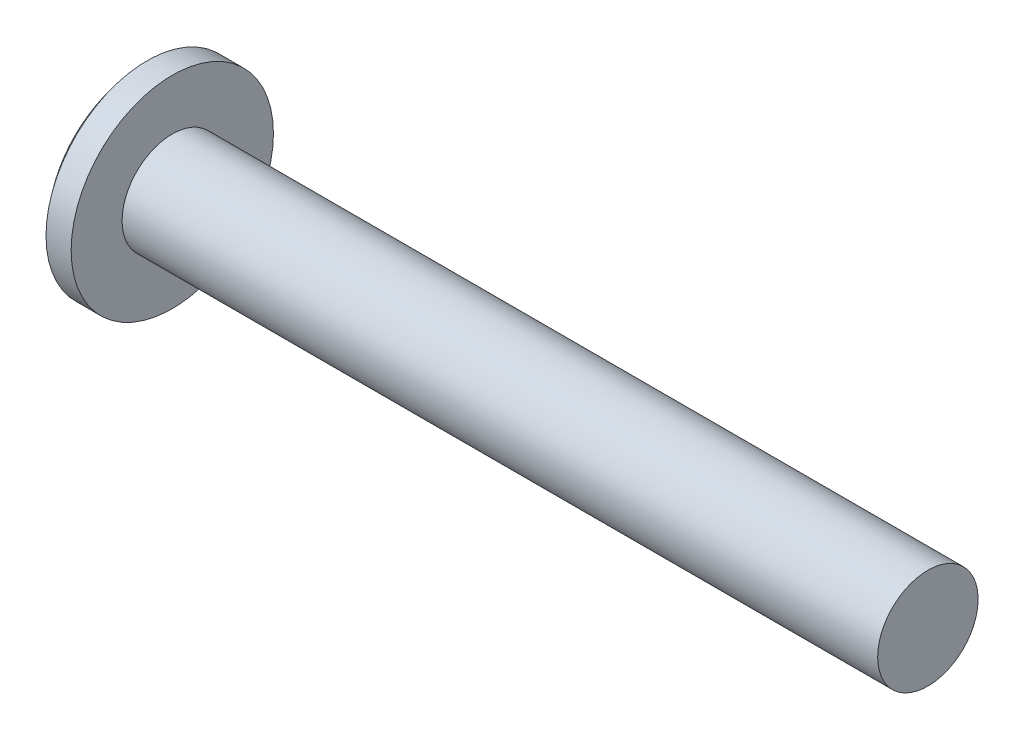
ISO-10303-21;
HEADER;
FILE_DESCRIPTION(('STEP AP214'),'2;1');
FILE_NAME('part.step','',(''),(''),'','','');
FILE_SCHEMA(('AUTOMOTIVE_DESIGN { 1 0 10303 214 1 1 1 1 }'));
ENDSEC;
DATA;
#1=APPLICATION_CONTEXT('core data for automotive mechanical design processes');
#2=APPLICATION_PROTOCOL_DEFINITION('international standard','automotive_design',2000,#1);
#3=PRODUCT_CONTEXT('',#1,'mechanical');
#4=PRODUCT('Part','Part','',(#3));
#5=PRODUCT_RELATED_PRODUCT_CATEGORY('part','',(#4));
#6=PRODUCT_DEFINITION_FORMATION('','',#4);
#7=PRODUCT_DEFINITION_CONTEXT('part definition',#1,'design');
#8=PRODUCT_DEFINITION('design','',#6,#7);
#9=PRODUCT_DEFINITION_SHAPE('','',#8);
#10=(LENGTH_UNIT() NAMED_UNIT(*) SI_UNIT(.MILLI.,.METRE.));
#11=(NAMED_UNIT(*) PLANE_ANGLE_UNIT() SI_UNIT($,.RADIAN.));
#12=(NAMED_UNIT(*) SI_UNIT($,.STERADIAN.) SOLID_ANGLE_UNIT());
#13=UNCERTAINTY_MEASURE_WITH_UNIT(LENGTH_MEASURE(1.E-05),#10,'distance_accuracy_value','');
#14=(GEOMETRIC_REPRESENTATION_CONTEXT(3) GLOBAL_UNCERTAINTY_ASSIGNED_CONTEXT((#13)) GLOBAL_UNIT_ASSIGNED_CONTEXT((#10,
#11,#12)) REPRESENTATION_CONTEXT('',''));
#15=CARTESIAN_POINT('',(0.,0.,0.));
#16=DIRECTION('',(0.,0.,1.));
#17=DIRECTION('',(1.,0.,0.));
#18=AXIS2_PLACEMENT_3D('',#15,#16,#17);
#19=CARTESIAN_POINT('',(8.5344,0.,0.));
#20=DIRECTION('',(-1.,0.,0.));
#21=DIRECTION('',(0.,1.,0.));
#22=AXIS2_PLACEMENT_3D('',#19,#20,#21);
#23=SPHERICAL_SURFACE('',#22,8.5344);
#24=CARTESIAN_POINT('',(2.0297587062775,0.,0.));
#25=DIRECTION('',(-1.,0.,0.));
#26=DIRECTION('',(0.,0.,1.));
#27=AXIS2_PLACEMENT_3D('',#24,#25,#26);
#28=CIRCLE('',#27,5.525);
#29=CARTESIAN_POINT('',(2.0297587062775,0.,5.525));
#30=VERTEX_POINT('',#29);
#31=EDGE_CURVE('E156',#30,#30,#28,.T.);
#32=ORIENTED_EDGE('',*,*,#31,.T.);
#33=EDGE_LOOP('',(#32));
#34=FACE_BOUND('',#33,.T.);
#35=CARTESIAN_POINT('',(8.53410560730797,-0.00385596702500976,0.));
#36=DIRECTION('',(-0.0761257626093691,-0.99709822398154,0.));
#37=DIRECTION('',(0.99709822398154,-0.0761257626093691,0.));
#38=AXIS2_PLACEMENT_3D('',#35,#36,#37);
#39=CIRCLE('',#38,8.53439912383123);
#40=CARTESIAN_POINT('',(0.623653953080768,0.600085701186936,3.14578726114509));
#41=VERTEX_POINT('',#40);
#42=CARTESIAN_POINT('',(0.0487318306459875,0.643979456043493,0.643979456043495));
#43=VERTEX_POINT('',#42);
#44=EDGE_CURVE('E190',#41,#43,#39,.T.);
#45=ORIENTED_EDGE('',*,*,#44,.F.);
#46=CARTESIAN_POINT('',(7.0678678871061,0.,-1.88031372632078));
#47=DIRECTION('',(0.61500244171573,0.,0.788525203581781));
#48=DIRECTION('',(0.788525203581781,0.,-0.61500244171573));
#49=AXIS2_PLACEMENT_3D('',#46,#47,#48);
#50=CIRCLE('',#49,8.19449127234026);
#51=CARTESIAN_POINT('',(0.623653953080769,-0.600085701186958,3.14578726114509));
#52=VERTEX_POINT('',#51);
#53=EDGE_CURVE('E154',#41,#52,#50,.T.);
#54=ORIENTED_EDGE('',*,*,#53,.T.);
#55=CARTESIAN_POINT('',(8.53410560730797,0.00385596702500976,0.));
#56=DIRECTION('',(-0.0761257626093691,0.99709822398154,0.));
#57=DIRECTION('',(-0.99709822398154,-0.0761257626093691,0.));
#58=AXIS2_PLACEMENT_3D('',#55,#56,#57);
#59=CIRCLE('',#58,8.53439912383123);
#60=CARTESIAN_POINT('',(0.0487318306459893,-0.643979456043497,0.643979456043494));
#61=VERTEX_POINT('',#60);
#62=EDGE_CURVE('E111',#61,#52,#59,.T.);
#63=ORIENTED_EDGE('',*,*,#62,.F.);
#64=CARTESIAN_POINT('',(8.53410560730797,0.,-0.00385596702500976));
#65=DIRECTION('',(-0.0761257626093691,0.,-0.99709822398154));
#66=DIRECTION('',(-0.99709822398154,0.,0.0761257626093691));
#67=AXIS2_PLACEMENT_3D('',#64,#65,#66);
#68=CIRCLE('',#67,8.53439912383123);
#69=CARTESIAN_POINT('',(0.62365395308077,-3.14578726114509,0.600085701186947));
#70=VERTEX_POINT('',#69);
#71=EDGE_CURVE('E137',#70,#61,#68,.T.);
#72=ORIENTED_EDGE('',*,*,#71,.F.);
#73=CARTESIAN_POINT('',(7.0678678871061,1.88031372632078,0.));
#74=DIRECTION('',(0.61500244171573,-0.788525203581781,0.));
#75=DIRECTION('',(0.788525203581781,0.61500244171573,0.));
#76=AXIS2_PLACEMENT_3D('',#73,#74,#75);
#77=CIRCLE('',#76,8.19449127234026);
#78=CARTESIAN_POINT('',(0.62365395308077,-3.14578726114509,-0.600085701186947));
#79=VERTEX_POINT('',#78);
#80=EDGE_CURVE('E144',#70,#79,#77,.T.);
#81=ORIENTED_EDGE('',*,*,#80,.T.);
#82=CARTESIAN_POINT('',(8.53410560730797,0.,0.00385596702500976));
#83=DIRECTION('',(-0.0761257626093691,0.,0.99709822398154));
#84=DIRECTION('',(0.99709822398154,0.,0.0761257626093691));
#85=AXIS2_PLACEMENT_3D('',#82,#83,#84);
#86=CIRCLE('',#85,8.53439912383123);
#87=CARTESIAN_POINT('',(0.0487318306459875,-0.643979456043493,-0.643979456043495));
#88=VERTEX_POINT('',#87);
#89=EDGE_CURVE('E53',#88,#79,#86,.T.);
#90=ORIENTED_EDGE('',*,*,#89,.F.);
#91=CARTESIAN_POINT('',(0.623653953080769,-0.600085701186936,-3.14578726114509));
#92=VERTEX_POINT('',#91);
#93=EDGE_CURVE('E191',#92,#88,#59,.T.);
#94=ORIENTED_EDGE('',*,*,#93,.F.);
#95=CARTESIAN_POINT('',(7.0678678871061,0.,1.88031372632078));
#96=DIRECTION('',(0.61500244171573,0.,-0.788525203581781));
#97=DIRECTION('',(-0.788525203581781,0.,-0.61500244171573));
#98=AXIS2_PLACEMENT_3D('',#95,#96,#97);
#99=CIRCLE('',#98,8.19449127234026);
#100=CARTESIAN_POINT('',(0.623653953080769,0.600085701186958,-3.14578726114509));
#101=VERTEX_POINT('',#100);
#102=EDGE_CURVE('E139',#92,#101,#99,.T.);
#103=ORIENTED_EDGE('',*,*,#102,.T.);
#104=CARTESIAN_POINT('',(0.0487318306459893,0.643979456043497,-0.643979456043495));
#105=VERTEX_POINT('',#104);
#106=EDGE_CURVE('E185',#105,#101,#39,.T.);
#107=ORIENTED_EDGE('',*,*,#106,.F.);
#108=CARTESIAN_POINT('',(0.623653953080768,3.14578726114509,-0.600085701186947));
#109=VERTEX_POINT('',#108);
#110=EDGE_CURVE('E50',#109,#105,#86,.T.);
#111=ORIENTED_EDGE('',*,*,#110,.F.);
#112=CARTESIAN_POINT('',(7.0678678871061,-1.88031372632077,0.));
#113=DIRECTION('',(0.61500244171573,0.788525203581781,0.));
#114=DIRECTION('',(-0.788525203581781,0.61500244171573,0.));
#115=AXIS2_PLACEMENT_3D('',#112,#113,#114);
#116=CIRCLE('',#115,8.19449127234026);
#117=CARTESIAN_POINT('',(0.623653953080768,3.14578726114509,0.600085701186948));
#118=VERTEX_POINT('',#117);
#119=EDGE_CURVE('E11',#109,#118,#116,.T.);
#120=ORIENTED_EDGE('',*,*,#119,.T.);
#121=EDGE_CURVE('E167',#43,#118,#68,.T.);
#122=ORIENTED_EDGE('',*,*,#121,.F.);
#123=EDGE_LOOP('',(#45,#54,#63,#72,#81,#90,#94,#103,#107,#111,#120,#122));
#124=FACE_BOUND('',#123,.T.);
#125=ADVANCED_FACE('F39',(#34,#124),#23,.T.);
#126=CARTESIAN_POINT('',(4.65702418426104,0.,-0.292148752399232));
#127=DIRECTION('',(-0.0761257626093691,0.,0.99709822398154));
#128=DIRECTION('',(0.99709822398154,0.,0.0761257626093691));
#129=AXIS2_PLACEMENT_3D('',#126,#127,#128);
#130=PLANE('',#129);
#131=ORIENTED_EDGE('',*,*,#110,.T.);
#132=DIRECTION('',(0.994221563152995,-0.0759061373065912,0.075906137306591));
#133=VECTOR('',#132,1.);
#134=CARTESIAN_POINT('',(4.67907192563335,0.290465466755539,-0.290465466755538));
#135=LINE('',#134,#133);
#136=CARTESIAN_POINT('',(4.2418,0.323850000000001,-0.323849999999999));
#137=VERTEX_POINT('',#136);
#138=EDGE_CURVE('E176',#105,#137,#135,.T.);
#139=ORIENTED_EDGE('',*,*,#138,.T.);
#140=DIRECTION('',(0.787100168255185,-0.613890999492442,0.0600929769176863));
#141=VECTOR('',#140,1.);
#142=CARTESIAN_POINT('',(0.,3.6322,-0.6477));
#143=LINE('',#142,#141);
#144=EDGE_CURVE('E158',#109,#137,#143,.T.);
#145=ORIENTED_EDGE('',*,*,#144,.F.);
#146=EDGE_LOOP('',(#131,#139,#145));
#147=FACE_BOUND('',#146,.T.);
#148=ADVANCED_FACE('F174',(#147),#130,.T.);
#149=DIRECTION('',(0.787100168255185,0.613890999492442,0.0600929769176863));
#150=VECTOR('',#149,1.);
#151=CARTESIAN_POINT('',(0.,-3.6322,-0.6477));
#152=LINE('',#151,#150);
#153=CARTESIAN_POINT('',(4.2418,-0.32385,-0.32385));
#154=VERTEX_POINT('',#153);
#155=EDGE_CURVE('E143',#79,#154,#152,.T.);
#156=ORIENTED_EDGE('',*,*,#155,.T.);
#157=DIRECTION('',(-0.994221563152996,-0.0759061373065907,-0.075906137306591));
#158=VECTOR('',#157,1.);
#159=CARTESIAN_POINT('',(4.67907192563335,-0.290465466755537,-0.290465466755538));
#160=LINE('',#159,#158);
#161=EDGE_CURVE('E200',#154,#88,#160,.T.);
#162=ORIENTED_EDGE('',*,*,#161,.T.);
#163=ORIENTED_EDGE('',*,*,#89,.T.);
#164=EDGE_LOOP('',(#156,#162,#163));
#165=FACE_BOUND('',#164,.T.);
#166=ADVANCED_FACE('F214',(#165),#130,.T.);
#167=CARTESIAN_POINT('',(4.65702418426104,0.,0.292148752399232));
#168=DIRECTION('',(-0.0761257626093691,0.,-0.99709822398154));
#169=DIRECTION('',(-0.99709822398154,0.,0.0761257626093691));
#170=AXIS2_PLACEMENT_3D('',#167,#168,#169);
#171=PLANE('',#170);
#172=DIRECTION('',(0.787100168255185,-0.613890999492442,-0.0600929769176863));
#173=VECTOR('',#172,1.);
#174=CARTESIAN_POINT('',(0.,3.6322,0.6477));
#175=LINE('',#174,#173);
#176=CARTESIAN_POINT('',(4.2418,0.32385,0.32385));
#177=VERTEX_POINT('',#176);
#178=EDGE_CURVE('E215',#118,#177,#175,.T.);
#179=ORIENTED_EDGE('',*,*,#178,.T.);
#180=DIRECTION('',(-0.994221563152996,0.0759061373065907,0.075906137306591));
#181=VECTOR('',#180,1.);
#182=CARTESIAN_POINT('',(4.67907192563335,0.290465466755537,0.290465466755538));
#183=LINE('',#182,#181);
#184=EDGE_CURVE('E192',#177,#43,#183,.T.);
#185=ORIENTED_EDGE('',*,*,#184,.T.);
#186=ORIENTED_EDGE('',*,*,#121,.T.);
#187=EDGE_LOOP('',(#179,#185,#186));
#188=FACE_BOUND('',#187,.T.);
#189=ADVANCED_FACE('F220',(#188),#171,.T.);
#190=ORIENTED_EDGE('',*,*,#71,.T.);
#191=DIRECTION('',(0.994221563152995,0.0759061373065912,-0.0759061373065909));
#192=VECTOR('',#191,1.);
#193=CARTESIAN_POINT('',(4.67907192563335,-0.290465466755539,0.290465466755538));
#194=LINE('',#193,#192);
#195=CARTESIAN_POINT('',(4.2418,-0.323850000000001,0.323849999999999));
#196=VERTEX_POINT('',#195);
#197=EDGE_CURVE('E107',#61,#196,#194,.T.);
#198=ORIENTED_EDGE('',*,*,#197,.T.);
#199=DIRECTION('',(0.787100168255185,0.613890999492442,-0.0600929769176862));
#200=VECTOR('',#199,1.);
#201=CARTESIAN_POINT('',(0.,-3.6322,0.647699999999999));
#202=LINE('',#201,#200);
#203=EDGE_CURVE('E132',#70,#196,#202,.T.);
#204=ORIENTED_EDGE('',*,*,#203,.F.);
#205=EDGE_LOOP('',(#190,#198,#204));
#206=FACE_BOUND('',#205,.T.);
#207=ADVANCED_FACE('F133',(#206),#171,.T.);
#208=CARTESIAN_POINT('',(-25.4,0.,0.));
#209=DIRECTION('',(-1.,0.,0.));
#210=DIRECTION('',(0.,0.,1.));
#211=AXIS2_PLACEMENT_3D('',#208,#209,#210);
#212=CYLINDRICAL_SURFACE('',#211,2.7432);
#213=CARTESIAN_POINT('',(44.6786,0.,0.));
#214=DIRECTION('',(-1.,0.,0.));
#215=DIRECTION('',(0.,0.,1.));
#216=AXIS2_PLACEMENT_3D('',#213,#214,#215);
#217=CIRCLE('',#216,2.7432);
#218=CARTESIAN_POINT('',(44.6786,0.,2.7432));
#219=VERTEX_POINT('',#218);
#220=EDGE_CURVE('E157',#219,#219,#217,.T.);
#221=ORIENTED_EDGE('',*,*,#220,.T.);
#222=EDGE_LOOP('',(#221));
#223=FACE_BOUND('',#222,.T.);
#224=CARTESIAN_POINT('',(3.4036,0.,0.));
#225=DIRECTION('',(-1.,0.,0.));
#226=DIRECTION('',(0.,0.,1.));
#227=AXIS2_PLACEMENT_3D('',#224,#225,#226);
#228=CIRCLE('',#227,2.7432);
#229=CARTESIAN_POINT('',(3.4036,0.,2.7432));
#230=VERTEX_POINT('',#229);
#231=EDGE_CURVE('E168',#230,#230,#228,.T.);
#232=ORIENTED_EDGE('',*,*,#231,.F.);
#233=EDGE_LOOP('',(#232));
#234=FACE_BOUND('',#233,.T.);
#235=ADVANCED_FACE('F41',(#223,#234),#212,.T.);
#236=CARTESIAN_POINT('',(3.4036,2.7432,0.));
#237=DIRECTION('',(-1.,0.,0.));
#238=DIRECTION('',(0.,0.,1.));
#239=AXIS2_PLACEMENT_3D('',#236,#237,#238);
#240=PLANE('',#239);
#241=CARTESIAN_POINT('',(3.4036,0.,0.));
#242=DIRECTION('',(-1.,0.,0.));
#243=DIRECTION('',(0.,0.,1.));
#244=AXIS2_PLACEMENT_3D('',#241,#242,#243);
#245=CIRCLE('',#244,5.525);
#246=CARTESIAN_POINT('',(3.4036,0.,5.525));
#247=VERTEX_POINT('',#246);
#248=EDGE_CURVE('E161',#247,#247,#245,.T.);
#249=ORIENTED_EDGE('',*,*,#248,.F.);
#250=EDGE_LOOP('',(#249));
#251=FACE_BOUND('',#250,.T.);
#252=ORIENTED_EDGE('',*,*,#231,.T.);
#253=EDGE_LOOP('',(#252));
#254=FACE_BOUND('',#253,.T.);
#255=ADVANCED_FACE('F245',(#251,#254),#240,.F.);
#256=CARTESIAN_POINT('',(-25.4,0.,0.));
#257=DIRECTION('',(-1.,0.,0.));
#258=DIRECTION('',(0.,0.,1.));
#259=AXIS2_PLACEMENT_3D('',#256,#257,#258);
#260=CYLINDRICAL_SURFACE('',#259,5.525);
#261=ORIENTED_EDGE('',*,*,#248,.T.);
#262=EDGE_LOOP('',(#261));
#263=FACE_BOUND('',#262,.T.);
#264=ORIENTED_EDGE('',*,*,#31,.F.);
#265=EDGE_LOOP('',(#264));
#266=FACE_BOUND('',#265,.T.);
#267=ADVANCED_FACE('F239',(#263,#266),#260,.T.);
#268=CARTESIAN_POINT('',(44.6786,2.7432,0.));
#269=DIRECTION('',(1.,0.,0.));
#270=DIRECTION('',(0.,0.,-1.));
#271=AXIS2_PLACEMENT_3D('',#268,#269,#270);
#272=PLANE('',#271);
#273=ORIENTED_EDGE('',*,*,#220,.F.);
#274=EDGE_LOOP('',(#273));
#275=FACE_BOUND('',#274,.T.);
#276=ADVANCED_FACE('F238',(#275),#272,.T.);
#277=CARTESIAN_POINT('',(0.,3.6322,0.6477));
#278=DIRECTION('',(0.61500244171573,0.788525203581781,0.));
#279=DIRECTION('',(-0.788525203581781,0.61500244171573,0.));
#280=AXIS2_PLACEMENT_3D('',#277,#278,#279);
#281=PLANE('',#280);
#282=ORIENTED_EDGE('',*,*,#144,.T.);
#283=DIRECTION('',(0.,0.,-1.));
#284=VECTOR('',#283,1.);
#285=CARTESIAN_POINT('',(4.2418,0.32385,0.32385));
#286=LINE('',#285,#284);
#287=EDGE_CURVE('E129',#177,#137,#286,.T.);
#288=ORIENTED_EDGE('',*,*,#287,.F.);
#289=ORIENTED_EDGE('',*,*,#178,.F.);
#290=ORIENTED_EDGE('',*,*,#119,.F.);
#291=EDGE_LOOP('',(#282,#288,#289,#290));
#292=FACE_BOUND('',#291,.T.);
#293=ADVANCED_FACE('F216',(#292),#281,.F.);
#294=CARTESIAN_POINT('',(4.2418,-0.32385,-0.32385));
#295=DIRECTION('',(0.61500244171573,-0.788525203581781,0.));
#296=DIRECTION('',(0.788525203581781,0.61500244171573,0.));
#297=AXIS2_PLACEMENT_3D('',#294,#295,#296);
#298=PLANE('',#297);
#299=ORIENTED_EDGE('',*,*,#203,.T.);
#300=DIRECTION('',(0.,0.,1.));
#301=VECTOR('',#300,1.);
#302=CARTESIAN_POINT('',(4.2418,-0.32385,-0.32385));
#303=LINE('',#302,#301);
#304=EDGE_CURVE('E127',#154,#196,#303,.T.);
#305=ORIENTED_EDGE('',*,*,#304,.F.);
#306=ORIENTED_EDGE('',*,*,#155,.F.);
#307=ORIENTED_EDGE('',*,*,#80,.F.);
#308=EDGE_LOOP('',(#299,#305,#306,#307));
#309=FACE_BOUND('',#308,.T.);
#310=ADVANCED_FACE('F142',(#309),#298,.F.);
#311=CARTESIAN_POINT('',(4.2418,0.32385,-0.32385));
#312=DIRECTION('',(-1.,0.,0.));
#313=DIRECTION('',(0.,0.,1.));
#314=AXIS2_PLACEMENT_3D('',#311,#312,#313);
#315=PLANE('',#314);
#316=DIRECTION('',(0.,1.,0.));
#317=VECTOR('',#316,1.);
#318=CARTESIAN_POINT('',(4.2418,-0.32385,-0.32385));
#319=LINE('',#318,#317);
#320=EDGE_CURVE('E146',#154,#137,#319,.T.);
#321=ORIENTED_EDGE('',*,*,#320,.F.);
#322=ORIENTED_EDGE('',*,*,#304,.T.);
#323=DIRECTION('',(0.,-1.,0.));
#324=VECTOR('',#323,1.);
#325=CARTESIAN_POINT('',(4.2418,0.32385,0.32385));
#326=LINE('',#325,#324);
#327=EDGE_CURVE('E117',#177,#196,#326,.T.);
#328=ORIENTED_EDGE('',*,*,#327,.F.);
#329=ORIENTED_EDGE('',*,*,#287,.T.);
#330=EDGE_LOOP('',(#321,#322,#328,#329));
#331=FACE_BOUND('',#330,.T.);
#332=ADVANCED_FACE('F149',(#331),#315,.T.);
#333=CARTESIAN_POINT('',(4.2418,0.323850000000001,-0.323849999999999));
#334=DIRECTION('',(0.61500244171573,0.,-0.788525203581781));
#335=DIRECTION('',(0.788525203581781,0.,0.61500244171573));
#336=AXIS2_PLACEMENT_3D('',#333,#334,#335);
#337=PLANE('',#336);
#338=DIRECTION('',(0.787100168255185,0.0600929769176841,0.613890999492442));
#339=VECTOR('',#338,1.);
#340=CARTESIAN_POINT('',(0.,-0.647699999999987,-3.6322));
#341=LINE('',#340,#339);
#342=EDGE_CURVE('E204',#92,#154,#341,.T.);
#343=ORIENTED_EDGE('',*,*,#342,.T.);
#344=ORIENTED_EDGE('',*,*,#320,.T.);
#345=DIRECTION('',(0.787100168255185,-0.0600929769176884,0.613890999492442));
#346=VECTOR('',#345,1.);
#347=CARTESIAN_POINT('',(0.,0.647700000000013,-3.6322));
#348=LINE('',#347,#346);
#349=EDGE_CURVE('E114',#101,#137,#348,.T.);
#350=ORIENTED_EDGE('',*,*,#349,.F.);
#351=ORIENTED_EDGE('',*,*,#102,.F.);
#352=EDGE_LOOP('',(#343,#344,#350,#351));
#353=FACE_BOUND('',#352,.T.);
#354=ADVANCED_FACE('F210',(#353),#337,.F.);
#355=CARTESIAN_POINT('',(4.65702418426104,-0.292148752399232,0.));
#356=DIRECTION('',(-0.0761257626093691,0.99709822398154,0.));
#357=DIRECTION('',(-0.99709822398154,-0.0761257626093691,0.));
#358=AXIS2_PLACEMENT_3D('',#355,#356,#357);
#359=PLANE('',#358);
#360=ORIENTED_EDGE('',*,*,#93,.T.);
#361=ORIENTED_EDGE('',*,*,#161,.F.);
#362=ORIENTED_EDGE('',*,*,#342,.F.);
#363=EDGE_LOOP('',(#360,#361,#362));
#364=FACE_BOUND('',#363,.T.);
#365=ADVANCED_FACE('F212',(#364),#359,.T.);
#366=CARTESIAN_POINT('',(4.65702418426104,0.292148752399232,0.));
#367=DIRECTION('',(-0.0761257626093691,-0.99709822398154,0.));
#368=DIRECTION('',(0.99709822398154,-0.0761257626093691,0.));
#369=AXIS2_PLACEMENT_3D('',#366,#367,#368);
#370=PLANE('',#369);
#371=ORIENTED_EDGE('',*,*,#106,.T.);
#372=ORIENTED_EDGE('',*,*,#349,.T.);
#373=ORIENTED_EDGE('',*,*,#138,.F.);
#374=EDGE_LOOP('',(#371,#372,#373));
#375=FACE_BOUND('',#374,.T.);
#376=ADVANCED_FACE('F203',(#375),#370,.T.);
#377=CARTESIAN_POINT('',(0.,-0.647700000000013,3.6322));
#378=DIRECTION('',(0.61500244171573,0.,0.788525203581781));
#379=DIRECTION('',(-0.788525203581781,0.,0.61500244171573));
#380=AXIS2_PLACEMENT_3D('',#377,#378,#379);
#381=PLANE('',#380);
#382=DIRECTION('',(0.787100168255185,-0.0600929769176841,-0.613890999492442));
#383=VECTOR('',#382,1.);
#384=CARTESIAN_POINT('',(0.,0.647699999999987,3.6322));
#385=LINE('',#384,#383);
#386=EDGE_CURVE('E112',#41,#177,#385,.T.);
#387=ORIENTED_EDGE('',*,*,#386,.T.);
#388=ORIENTED_EDGE('',*,*,#327,.T.);
#389=DIRECTION('',(0.787100168255185,0.0600929769176885,-0.613890999492442));
#390=VECTOR('',#389,1.);
#391=CARTESIAN_POINT('',(0.,-0.647700000000013,3.6322));
#392=LINE('',#391,#390);
#393=EDGE_CURVE('E102',#52,#196,#392,.T.);
#394=ORIENTED_EDGE('',*,*,#393,.F.);
#395=ORIENTED_EDGE('',*,*,#53,.F.);
#396=EDGE_LOOP('',(#387,#388,#394,#395));
#397=FACE_BOUND('',#396,.T.);
#398=ADVANCED_FACE('F118',(#397),#381,.F.);
#399=ORIENTED_EDGE('',*,*,#44,.T.);
#400=ORIENTED_EDGE('',*,*,#184,.F.);
#401=ORIENTED_EDGE('',*,*,#386,.F.);
#402=EDGE_LOOP('',(#399,#400,#401));
#403=FACE_BOUND('',#402,.T.);
#404=ADVANCED_FACE('F218',(#403),#370,.T.);
#405=ORIENTED_EDGE('',*,*,#62,.T.);
#406=ORIENTED_EDGE('',*,*,#393,.T.);
#407=ORIENTED_EDGE('',*,*,#197,.F.);
#408=EDGE_LOOP('',(#405,#406,#407));
#409=FACE_BOUND('',#408,.T.);
#410=ADVANCED_FACE('F110',(#409),#359,.T.);
#411=CLOSED_SHELL('',(#125,#148,#166,#189,#207,#235,#255,#267,#276,#293,#310,#332,#354,#365,
#376,#398,#404,#410));
#412=MANIFOLD_SOLID_BREP('B2',#411);
#413=ADVANCED_BREP_SHAPE_REPRESENTATION('',(#18,#412),#14);
#414=SHAPE_DEFINITION_REPRESENTATION(#9,#413);
ENDSEC;
END-ISO-10303-21;
